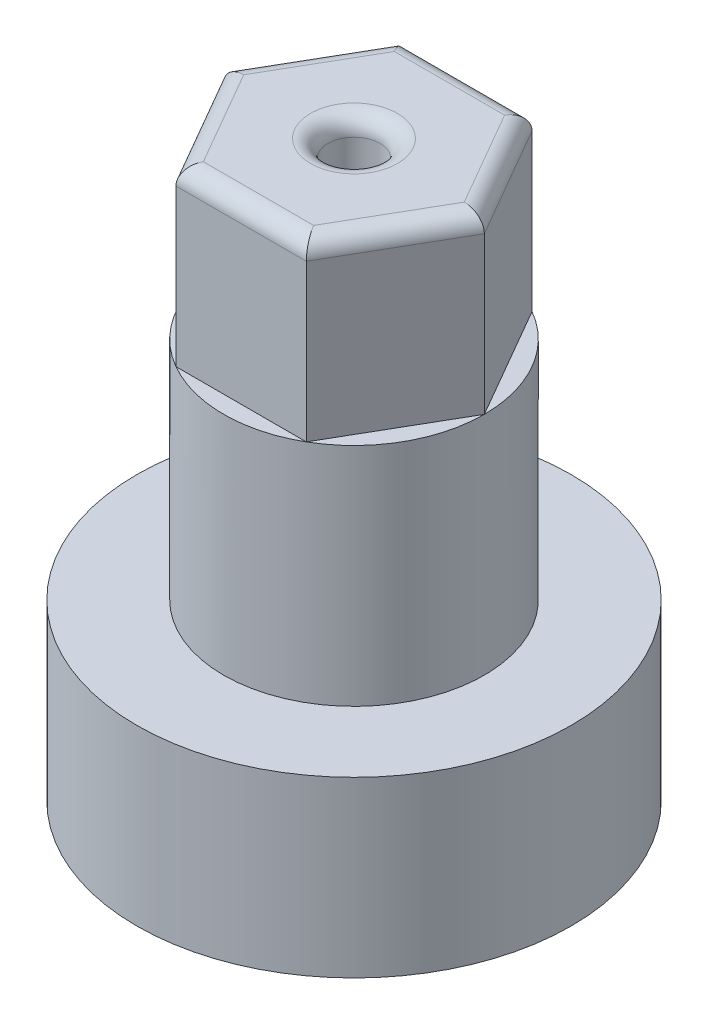
ISO-10303-21;
HEADER;
FILE_DESCRIPTION(('STEP AP214'),'2;1');
FILE_NAME('part.step','',(''),(''),'','','');
FILE_SCHEMA(('AUTOMOTIVE_DESIGN { 1 0 10303 214 1 1 1 1 }'));
ENDSEC;
DATA;
#1=APPLICATION_CONTEXT('core data for automotive mechanical design processes');
#2=APPLICATION_PROTOCOL_DEFINITION('international standard','automotive_design',2000,#1);
#3=PRODUCT_CONTEXT('',#1,'mechanical');
#4=PRODUCT('Part','Part','',(#3));
#5=PRODUCT_RELATED_PRODUCT_CATEGORY('part','',(#4));
#6=PRODUCT_DEFINITION_FORMATION('','',#4);
#7=PRODUCT_DEFINITION_CONTEXT('part definition',#1,'design');
#8=PRODUCT_DEFINITION('design','',#6,#7);
#9=PRODUCT_DEFINITION_SHAPE('','',#8);
#10=(LENGTH_UNIT() NAMED_UNIT(*) SI_UNIT(.MILLI.,.METRE.));
#11=(NAMED_UNIT(*) PLANE_ANGLE_UNIT() SI_UNIT($,.RADIAN.));
#12=(NAMED_UNIT(*) SI_UNIT($,.STERADIAN.) SOLID_ANGLE_UNIT());
#13=UNCERTAINTY_MEASURE_WITH_UNIT(LENGTH_MEASURE(1.E-05),#10,'distance_accuracy_value','');
#14=(GEOMETRIC_REPRESENTATION_CONTEXT(3) GLOBAL_UNCERTAINTY_ASSIGNED_CONTEXT((#13)) GLOBAL_UNIT_ASSIGNED_CONTEXT((#10,
#11,#12)) REPRESENTATION_CONTEXT('',''));
#15=CARTESIAN_POINT('',(0.,0.,0.));
#16=DIRECTION('',(0.,0.,1.));
#17=DIRECTION('',(1.,0.,0.));
#18=AXIS2_PLACEMENT_3D('',#15,#16,#17);
#19=CARTESIAN_POINT('',(0.,23.,0.));
#20=DIRECTION('',(0.,1.,0.));
#21=DIRECTION('',(0.,0.,1.));
#22=AXIS2_PLACEMENT_3D('',#19,#20,#21);
#23=PLANE('',#22);
#24=DIRECTION('',(0.499999999999995,0.,-0.866025403784441));
#25=VECTOR('',#24,1.);
#26=CARTESIAN_POINT('',(3.75000000000008,23.,6.49519052838325));
#27=LINE('',#26,#25);
#28=CARTESIAN_POINT('',(3.75000000000008,23.,6.49519052838325));
#29=VERTEX_POINT('',#28);
#30=CARTESIAN_POINT('',(7.5,23.,0.));
#31=VERTEX_POINT('',#30);
#32=EDGE_CURVE('E140',#29,#31,#27,.T.);
#33=ORIENTED_EDGE('',*,*,#32,.F.);
#34=CARTESIAN_POINT('',(0.,23.,0.));
#35=DIRECTION('',(0.,1.,0.));
#36=DIRECTION('',(0.,0.,1.));
#37=AXIS2_PLACEMENT_3D('',#34,#35,#36);
#38=CIRCLE('',#37,7.5);
#39=EDGE_CURVE('E125',#29,#31,#38,.T.);
#40=ORIENTED_EDGE('',*,*,#39,.T.);
#41=EDGE_LOOP('',(#33,#40));
#42=FACE_BOUND('',#41,.T.);
#43=ADVANCED_FACE('F33',(#42),#23,.T.);
#44=DIRECTION('',(1.,0.,0.));
#45=VECTOR('',#44,1.);
#46=CARTESIAN_POINT('',(-3.74999999999994,23.,6.49519052838332));
#47=LINE('',#46,#45);
#48=CARTESIAN_POINT('',(-3.74999999999994,23.,6.49519052838332));
#49=VERTEX_POINT('',#48);
#50=EDGE_CURVE('E152',#49,#29,#47,.T.);
#51=ORIENTED_EDGE('',*,*,#50,.F.);
#52=EDGE_CURVE('E172',#49,#29,#38,.T.);
#53=ORIENTED_EDGE('',*,*,#52,.T.);
#54=EDGE_LOOP('',(#51,#53));
#55=FACE_BOUND('',#54,.T.);
#56=ADVANCED_FACE('F263',(#55),#23,.T.);
#57=DIRECTION('',(0.500000000000007,0.,0.866025403784435));
#58=VECTOR('',#57,1.);
#59=CARTESIAN_POINT('',(-7.5,23.,0.));
#60=LINE('',#59,#58);
#61=CARTESIAN_POINT('',(-7.5,23.,0.));
#62=VERTEX_POINT('',#61);
#63=EDGE_CURVE('E149',#62,#49,#60,.T.);
#64=ORIENTED_EDGE('',*,*,#63,.F.);
#65=EDGE_CURVE('E333',#62,#49,#38,.T.);
#66=ORIENTED_EDGE('',*,*,#65,.T.);
#67=EDGE_LOOP('',(#64,#66));
#68=FACE_BOUND('',#67,.T.);
#69=ADVANCED_FACE('F269',(#68),#23,.T.);
#70=DIRECTION('',(-0.499999999999995,0.,0.866025403784442));
#71=VECTOR('',#70,1.);
#72=CARTESIAN_POINT('',(-3.75000000000003,23.,-6.49519052838327));
#73=LINE('',#72,#71);
#74=CARTESIAN_POINT('',(-3.75000000000003,23.,-6.49519052838327));
#75=VERTEX_POINT('',#74);
#76=EDGE_CURVE('E137',#75,#62,#73,.T.);
#77=ORIENTED_EDGE('',*,*,#76,.F.);
#78=EDGE_CURVE('E134',#75,#62,#38,.T.);
#79=ORIENTED_EDGE('',*,*,#78,.T.);
#80=EDGE_LOOP('',(#77,#79));
#81=FACE_BOUND('',#80,.T.);
#82=ADVANCED_FACE('F286',(#81),#23,.T.);
#83=DIRECTION('',(-1.,0.,0.));
#84=VECTOR('',#83,1.);
#85=CARTESIAN_POINT('',(3.74999999999998,23.,-6.4951905283833));
#86=LINE('',#85,#84);
#87=CARTESIAN_POINT('',(3.74999999999998,23.,-6.4951905283833));
#88=VERTEX_POINT('',#87);
#89=EDGE_CURVE('E109',#88,#75,#86,.T.);
#90=ORIENTED_EDGE('',*,*,#89,.F.);
#91=EDGE_CURVE('E126',#88,#75,#38,.T.);
#92=ORIENTED_EDGE('',*,*,#91,.T.);
#93=EDGE_LOOP('',(#90,#92));
#94=FACE_BOUND('',#93,.T.);
#95=ADVANCED_FACE('F136',(#94),#23,.T.);
#96=CARTESIAN_POINT('',(7.,10.,0.));
#97=DIRECTION('',(0.,-1.,0.));
#98=DIRECTION('',(0.,0.,-1.));
#99=AXIS2_PLACEMENT_3D('',#96,#97,#98);
#100=CYLINDRICAL_SURFACE('',#99,0.750000000000001);
#101=CARTESIAN_POINT('',(7.,0.,0.));
#102=DIRECTION('',(0.,1.,0.));
#103=DIRECTION('',(0.,0.,1.));
#104=AXIS2_PLACEMENT_3D('',#101,#102,#103);
#105=CIRCLE('',#104,0.750000000000001);
#106=CARTESIAN_POINT('',(7.,0.,0.750000000000001));
#107=VERTEX_POINT('',#106);
#108=EDGE_CURVE('E188',#107,#107,#105,.T.);
#109=ORIENTED_EDGE('',*,*,#108,.F.);
#110=EDGE_LOOP('',(#109));
#111=FACE_BOUND('',#110,.T.);
#112=CARTESIAN_POINT('',(7.,9.,0.));
#113=DIRECTION('',(0.,1.,0.));
#114=DIRECTION('',(0.,0.,1.));
#115=AXIS2_PLACEMENT_3D('',#112,#113,#114);
#116=CIRCLE('',#115,0.750000000000001);
#117=CARTESIAN_POINT('',(7.,9.,0.750000000000001));
#118=VERTEX_POINT('',#117);
#119=EDGE_CURVE('E170',#118,#118,#116,.T.);
#120=ORIENTED_EDGE('',*,*,#119,.T.);
#121=EDGE_LOOP('',(#120));
#122=FACE_BOUND('',#121,.T.);
#123=ADVANCED_FACE('F285',(#111,#122),#100,.F.);
#124=CARTESIAN_POINT('',(0.,10.,7.));
#125=DIRECTION('',(0.,-1.,0.));
#126=DIRECTION('',(0.,0.,-1.));
#127=AXIS2_PLACEMENT_3D('',#124,#125,#126);
#128=CYLINDRICAL_SURFACE('',#127,0.750000000000001);
#129=CARTESIAN_POINT('',(0.,0.,7.));
#130=DIRECTION('',(0.,1.,0.));
#131=DIRECTION('',(0.,0.,1.));
#132=AXIS2_PLACEMENT_3D('',#129,#130,#131);
#133=CIRCLE('',#132,0.750000000000001);
#134=CARTESIAN_POINT('',(0.,0.,7.75));
#135=VERTEX_POINT('',#134);
#136=EDGE_CURVE('E185',#135,#135,#133,.T.);
#137=ORIENTED_EDGE('',*,*,#136,.F.);
#138=EDGE_LOOP('',(#137));
#139=FACE_BOUND('',#138,.T.);
#140=CARTESIAN_POINT('',(0.,9.,7.));
#141=DIRECTION('',(0.,1.,0.));
#142=DIRECTION('',(0.,0.,1.));
#143=AXIS2_PLACEMENT_3D('',#140,#141,#142);
#144=CIRCLE('',#143,0.750000000000001);
#145=CARTESIAN_POINT('',(0.,9.,7.75));
#146=VERTEX_POINT('',#145);
#147=EDGE_CURVE('E167',#146,#146,#144,.T.);
#148=ORIENTED_EDGE('',*,*,#147,.T.);
#149=EDGE_LOOP('',(#148));
#150=FACE_BOUND('',#149,.T.);
#151=ADVANCED_FACE('F291',(#139,#150),#128,.F.);
#152=CARTESIAN_POINT('',(-7.,10.,0.));
#153=DIRECTION('',(0.,-1.,0.));
#154=DIRECTION('',(0.,0.,-1.));
#155=AXIS2_PLACEMENT_3D('',#152,#153,#154);
#156=CYLINDRICAL_SURFACE('',#155,0.750000000000001);
#157=CARTESIAN_POINT('',(-7.,0.,0.));
#158=DIRECTION('',(0.,1.,0.));
#159=DIRECTION('',(0.,0.,1.));
#160=AXIS2_PLACEMENT_3D('',#157,#158,#159);
#161=CIRCLE('',#160,0.750000000000001);
#162=CARTESIAN_POINT('',(-7.,0.,0.749999999999952));
#163=VERTEX_POINT('',#162);
#164=EDGE_CURVE('E182',#163,#163,#161,.T.);
#165=ORIENTED_EDGE('',*,*,#164,.F.);
#166=EDGE_LOOP('',(#165));
#167=FACE_BOUND('',#166,.T.);
#168=CARTESIAN_POINT('',(-7.,9.,0.));
#169=DIRECTION('',(0.,1.,0.));
#170=DIRECTION('',(0.,0.,1.));
#171=AXIS2_PLACEMENT_3D('',#168,#169,#170);
#172=CIRCLE('',#171,0.750000000000001);
#173=CARTESIAN_POINT('',(-7.,9.,0.749999999999952));
#174=VERTEX_POINT('',#173);
#175=EDGE_CURVE('E164',#174,#174,#172,.T.);
#176=ORIENTED_EDGE('',*,*,#175,.T.);
#177=EDGE_LOOP('',(#176));
#178=FACE_BOUND('',#177,.T.);
#179=ADVANCED_FACE('F364',(#167,#178),#156,.F.);
#180=CARTESIAN_POINT('',(0.,10.,-7.));
#181=DIRECTION('',(0.,-1.,0.));
#182=DIRECTION('',(0.,0.,-1.));
#183=AXIS2_PLACEMENT_3D('',#180,#181,#182);
#184=CYLINDRICAL_SURFACE('',#183,0.750000000000002);
#185=CARTESIAN_POINT('',(0.,0.,-7.));
#186=DIRECTION('',(0.,1.,0.));
#187=DIRECTION('',(0.,0.,1.));
#188=AXIS2_PLACEMENT_3D('',#185,#186,#187);
#189=CIRCLE('',#188,0.750000000000002);
#190=CARTESIAN_POINT('',(0.,0.,-6.25));
#191=VERTEX_POINT('',#190);
#192=EDGE_CURVE('E174',#191,#191,#189,.T.);
#193=ORIENTED_EDGE('',*,*,#192,.F.);
#194=EDGE_LOOP('',(#193));
#195=FACE_BOUND('',#194,.T.);
#196=CARTESIAN_POINT('',(0.,9.,-7.));
#197=DIRECTION('',(0.,1.,0.));
#198=DIRECTION('',(0.,0.,1.));
#199=AXIS2_PLACEMENT_3D('',#196,#197,#198);
#200=CIRCLE('',#199,0.750000000000002);
#201=CARTESIAN_POINT('',(0.,9.,-6.25));
#202=VERTEX_POINT('',#201);
#203=EDGE_CURVE('E163',#202,#202,#200,.T.);
#204=ORIENTED_EDGE('',*,*,#203,.T.);
#205=EDGE_LOOP('',(#204));
#206=FACE_BOUND('',#205,.T.);
#207=ADVANCED_FACE('F370',(#195,#206),#184,.F.);
#208=CARTESIAN_POINT('',(0.,10.,0.));
#209=DIRECTION('',(0.,1.,0.));
#210=DIRECTION('',(0.,0.,1.));
#211=AXIS2_PLACEMENT_3D('',#208,#209,#210);
#212=PLANE('',#211);
#213=CARTESIAN_POINT('',(0.,10.,0.));
#214=DIRECTION('',(0.,1.,0.));
#215=DIRECTION('',(0.,0.,1.));
#216=AXIS2_PLACEMENT_3D('',#213,#214,#215);
#217=CIRCLE('',#216,7.5);
#218=CARTESIAN_POINT('',(0.,10.,7.5));
#219=VERTEX_POINT('',#218);
#220=EDGE_CURVE('E175',#219,#219,#217,.T.);
#221=ORIENTED_EDGE('',*,*,#220,.F.);
#222=EDGE_LOOP('',(#221));
#223=FACE_BOUND('',#222,.T.);
#224=CARTESIAN_POINT('',(0.,10.,0.));
#225=DIRECTION('',(0.,1.,0.));
#226=DIRECTION('',(0.,0.,1.));
#227=AXIS2_PLACEMENT_3D('',#224,#225,#226);
#228=CIRCLE('',#227,12.5);
#229=CARTESIAN_POINT('',(0.,10.,12.5));
#230=VERTEX_POINT('',#229);
#231=EDGE_CURVE('E179',#230,#230,#228,.T.);
#232=ORIENTED_EDGE('',*,*,#231,.T.);
#233=EDGE_LOOP('',(#232));
#234=FACE_BOUND('',#233,.T.);
#235=ADVANCED_FACE('F376',(#223,#234),#212,.T.);
#236=CARTESIAN_POINT('',(0.,0.,0.));
#237=DIRECTION('',(0.,1.,0.));
#238=DIRECTION('',(0.,0.,1.));
#239=AXIS2_PLACEMENT_3D('',#236,#237,#238);
#240=PLANE('',#239);
#241=CARTESIAN_POINT('',(0.,0.,0.));
#242=DIRECTION('',(0.,1.,0.));
#243=DIRECTION('',(0.,0.,1.));
#244=AXIS2_PLACEMENT_3D('',#241,#242,#243);
#245=CIRCLE('',#244,1.5);
#246=CARTESIAN_POINT('',(0.,0.,1.5));
#247=VERTEX_POINT('',#246);
#248=EDGE_CURVE('E143',#247,#247,#245,.T.);
#249=ORIENTED_EDGE('',*,*,#248,.T.);
#250=EDGE_LOOP('',(#249));
#251=FACE_BOUND('',#250,.T.);
#252=CARTESIAN_POINT('',(0.,0.,0.));
#253=DIRECTION('',(0.,1.,0.));
#254=DIRECTION('',(0.,0.,1.));
#255=AXIS2_PLACEMENT_3D('',#252,#253,#254);
#256=CIRCLE('',#255,12.5);
#257=CARTESIAN_POINT('',(0.,0.,12.5));
#258=VERTEX_POINT('',#257);
#259=EDGE_CURVE('E191',#258,#258,#256,.T.);
#260=ORIENTED_EDGE('',*,*,#259,.F.);
#261=EDGE_LOOP('',(#260));
#262=FACE_BOUND('',#261,.T.);
#263=ORIENTED_EDGE('',*,*,#108,.T.);
#264=EDGE_LOOP('',(#263));
#265=FACE_BOUND('',#264,.T.);
#266=ORIENTED_EDGE('',*,*,#136,.T.);
#267=EDGE_LOOP('',(#266));
#268=FACE_BOUND('',#267,.T.);
#269=ORIENTED_EDGE('',*,*,#164,.T.);
#270=EDGE_LOOP('',(#269));
#271=FACE_BOUND('',#270,.T.);
#272=ORIENTED_EDGE('',*,*,#192,.T.);
#273=EDGE_LOOP('',(#272));
#274=FACE_BOUND('',#273,.T.);
#275=ADVANCED_FACE('F244',(#251,#262,#265,#268,#271,#274),#240,.F.);
#276=CARTESIAN_POINT('',(0.,10.,0.));
#277=DIRECTION('',(0.,-1.,0.));
#278=DIRECTION('',(0.,0.,-1.));
#279=AXIS2_PLACEMENT_3D('',#276,#277,#278);
#280=CYLINDRICAL_SURFACE('',#279,12.5);
#281=ORIENTED_EDGE('',*,*,#231,.F.);
#282=EDGE_LOOP('',(#281));
#283=FACE_BOUND('',#282,.T.);
#284=ORIENTED_EDGE('',*,*,#259,.T.);
#285=EDGE_LOOP('',(#284));
#286=FACE_BOUND('',#285,.T.);
#287=ADVANCED_FACE('F283',(#283,#286),#280,.T.);
#288=CARTESIAN_POINT('',(0.,23.,0.));
#289=DIRECTION('',(0.,-1.,0.));
#290=DIRECTION('',(0.,0.,-1.));
#291=AXIS2_PLACEMENT_3D('',#288,#289,#290);
#292=CYLINDRICAL_SURFACE('',#291,7.5);
#293=ORIENTED_EDGE('',*,*,#39,.F.);
#294=ORIENTED_EDGE('',*,*,#52,.F.);
#295=ORIENTED_EDGE('',*,*,#65,.F.);
#296=ORIENTED_EDGE('',*,*,#78,.F.);
#297=ORIENTED_EDGE('',*,*,#91,.F.);
#298=EDGE_CURVE('E118',#31,#88,#38,.T.);
#299=ORIENTED_EDGE('',*,*,#298,.F.);
#300=EDGE_LOOP('',(#293,#294,#295,#296,#297,#299));
#301=FACE_BOUND('',#300,.T.);
#302=ORIENTED_EDGE('',*,*,#220,.T.);
#303=EDGE_LOOP('',(#302));
#304=FACE_BOUND('',#303,.T.);
#305=ADVANCED_FACE('F130',(#301,#304),#292,.T.);
#306=DIRECTION('',(-0.500000000000001,0.,-0.866025403784438));
#307=VECTOR('',#306,1.);
#308=CARTESIAN_POINT('',(7.5,23.,0.));
#309=LINE('',#308,#307);
#310=EDGE_CURVE('E121',#31,#88,#309,.T.);
#311=ORIENTED_EDGE('',*,*,#310,.F.);
#312=ORIENTED_EDGE('',*,*,#298,.T.);
#313=EDGE_LOOP('',(#311,#312));
#314=FACE_BOUND('',#313,.T.);
#315=ADVANCED_FACE('F120',(#314),#23,.T.);
#316=CARTESIAN_POINT('',(0.,9.,0.));
#317=DIRECTION('',(0.,1.,0.));
#318=DIRECTION('',(0.,0.,1.));
#319=AXIS2_PLACEMENT_3D('',#316,#317,#318);
#320=PLANE('',#319);
#321=ORIENTED_EDGE('',*,*,#203,.F.);
#322=EDGE_LOOP('',(#321));
#323=FACE_BOUND('',#322,.T.);
#324=ADVANCED_FACE('F275',(#323),#320,.F.);
#325=ORIENTED_EDGE('',*,*,#175,.F.);
#326=EDGE_LOOP('',(#325));
#327=FACE_BOUND('',#326,.T.);
#328=ADVANCED_FACE('F280',(#327),#320,.F.);
#329=ORIENTED_EDGE('',*,*,#147,.F.);
#330=EDGE_LOOP('',(#329));
#331=FACE_BOUND('',#330,.T.);
#332=ADVANCED_FACE('F349',(#331),#320,.F.);
#333=ORIENTED_EDGE('',*,*,#119,.F.);
#334=EDGE_LOOP('',(#333));
#335=FACE_BOUND('',#334,.T.);
#336=ADVANCED_FACE('F282',(#335),#320,.F.);
#337=CARTESIAN_POINT('',(3.75000000000008,33.,6.49519052838325));
#338=DIRECTION('',(-0.866025403784442,0.,-0.499999999999995));
#339=DIRECTION('',(-0.499999999999995,0.,0.866025403784442));
#340=AXIS2_PLACEMENT_3D('',#337,#338,#339);
#341=PLANE('',#340);
#342=DIRECTION('',(0.,-1.,0.));
#343=VECTOR('',#342,1.);
#344=CARTESIAN_POINT('',(7.5,33.,0.));
#345=LINE('',#344,#343);
#346=CARTESIAN_POINT('',(7.5,32.,0.));
#347=VERTEX_POINT('',#346);
#348=EDGE_CURVE('E112',#347,#31,#345,.T.);
#349=ORIENTED_EDGE('',*,*,#348,.F.);
#350=DIRECTION('',(0.499999999999995,0.,-0.866025403784442));
#351=VECTOR('',#350,1.);
#352=CARTESIAN_POINT('',(3.75000000000008,32.,6.49519052838325));
#353=LINE('',#352,#351);
#354=CARTESIAN_POINT('',(3.75000000000008,32.,6.49519052838325));
#355=VERTEX_POINT('',#354);
#356=EDGE_CURVE('E42',#347,#355,#353,.F.);
#357=ORIENTED_EDGE('',*,*,#356,.T.);
#358=DIRECTION('',(0.,-1.,0.));
#359=VECTOR('',#358,1.);
#360=CARTESIAN_POINT('',(3.75000000000008,33.,6.49519052838325));
#361=LINE('',#360,#359);
#362=EDGE_CURVE('E155',#355,#29,#361,.T.);
#363=ORIENTED_EDGE('',*,*,#362,.T.);
#364=ORIENTED_EDGE('',*,*,#32,.T.);
#365=EDGE_LOOP('',(#349,#357,#363,#364));
#366=FACE_BOUND('',#365,.T.);
#367=ADVANCED_FACE('F313',(#366),#341,.F.);
#368=CARTESIAN_POINT('',(7.5,33.,0.));
#369=DIRECTION('',(-0.866025403784438,0.,0.500000000000001));
#370=DIRECTION('',(0.500000000000001,0.,0.866025403784438));
#371=AXIS2_PLACEMENT_3D('',#368,#369,#370);
#372=PLANE('',#371);
#373=DIRECTION('',(0.,-1.,0.));
#374=VECTOR('',#373,1.);
#375=CARTESIAN_POINT('',(3.74999999999998,33.,-6.4951905283833));
#376=LINE('',#375,#374);
#377=CARTESIAN_POINT('',(3.74999999999998,32.,-6.4951905283833));
#378=VERTEX_POINT('',#377);
#379=EDGE_CURVE('E105',#378,#88,#376,.T.);
#380=ORIENTED_EDGE('',*,*,#379,.F.);
#381=DIRECTION('',(-0.500000000000001,0.,-0.866025403784438));
#382=VECTOR('',#381,1.);
#383=CARTESIAN_POINT('',(7.5,32.,0.));
#384=LINE('',#383,#382);
#385=EDGE_CURVE('E50',#378,#347,#384,.F.);
#386=ORIENTED_EDGE('',*,*,#385,.T.);
#387=ORIENTED_EDGE('',*,*,#348,.T.);
#388=ORIENTED_EDGE('',*,*,#310,.T.);
#389=EDGE_LOOP('',(#380,#386,#387,#388));
#390=FACE_BOUND('',#389,.T.);
#391=ADVANCED_FACE('F139',(#390),#372,.F.);
#392=CARTESIAN_POINT('',(3.74999999999998,33.,-6.4951905283833));
#393=DIRECTION('',(0.,0.,1.));
#394=DIRECTION('',(1.,0.,0.));
#395=AXIS2_PLACEMENT_3D('',#392,#393,#394);
#396=PLANE('',#395);
#397=DIRECTION('',(0.,-1.,0.));
#398=VECTOR('',#397,1.);
#399=CARTESIAN_POINT('',(-3.75000000000003,33.,-6.49519052838327));
#400=LINE('',#399,#398);
#401=CARTESIAN_POINT('',(-3.75000000000003,32.,-6.49519052838327));
#402=VERTEX_POINT('',#401);
#403=EDGE_CURVE('E113',#402,#75,#400,.T.);
#404=ORIENTED_EDGE('',*,*,#403,.F.);
#405=DIRECTION('',(-1.,0.,0.));
#406=VECTOR('',#405,1.);
#407=CARTESIAN_POINT('',(3.74999999999998,32.,-6.4951905283833));
#408=LINE('',#407,#406);
#409=EDGE_CURVE('E58',#402,#378,#408,.F.);
#410=ORIENTED_EDGE('',*,*,#409,.T.);
#411=ORIENTED_EDGE('',*,*,#379,.T.);
#412=ORIENTED_EDGE('',*,*,#89,.T.);
#413=EDGE_LOOP('',(#404,#410,#411,#412));
#414=FACE_BOUND('',#413,.T.);
#415=ADVANCED_FACE('F107',(#414),#396,.F.);
#416=CARTESIAN_POINT('',(-3.75000000000003,33.,-6.49519052838327));
#417=DIRECTION('',(0.866025403784442,0.,0.499999999999995));
#418=DIRECTION('',(0.499999999999995,0.,-0.866025403784442));
#419=AXIS2_PLACEMENT_3D('',#416,#417,#418);
#420=PLANE('',#419);
#421=DIRECTION('',(0.,-1.,0.));
#422=VECTOR('',#421,1.);
#423=CARTESIAN_POINT('',(-7.5,33.,0.));
#424=LINE('',#423,#422);
#425=CARTESIAN_POINT('',(-7.5,32.,0.));
#426=VERTEX_POINT('',#425);
#427=EDGE_CURVE('E159',#426,#62,#424,.T.);
#428=ORIENTED_EDGE('',*,*,#427,.F.);
#429=DIRECTION('',(-0.499999999999995,0.,0.866025403784442));
#430=VECTOR('',#429,1.);
#431=CARTESIAN_POINT('',(-3.75000000000003,32.,-6.49519052838327));
#432=LINE('',#431,#430);
#433=EDGE_CURVE('E218',#426,#402,#432,.F.);
#434=ORIENTED_EDGE('',*,*,#433,.T.);
#435=ORIENTED_EDGE('',*,*,#403,.T.);
#436=ORIENTED_EDGE('',*,*,#76,.T.);
#437=EDGE_LOOP('',(#428,#434,#435,#436));
#438=FACE_BOUND('',#437,.T.);
#439=ADVANCED_FACE('F302',(#438),#420,.F.);
#440=CARTESIAN_POINT('',(-7.5,33.,0.));
#441=DIRECTION('',(0.866025403784434,0.,-0.500000000000007));
#442=DIRECTION('',(-0.500000000000007,0.,-0.866025403784435));
#443=AXIS2_PLACEMENT_3D('',#440,#441,#442);
#444=PLANE('',#443);
#445=DIRECTION('',(0.,-1.,0.));
#446=VECTOR('',#445,1.);
#447=CARTESIAN_POINT('',(-3.74999999999994,33.,6.49519052838332));
#448=LINE('',#447,#446);
#449=CARTESIAN_POINT('',(-3.74999999999994,32.,6.49519052838332));
#450=VERTEX_POINT('',#449);
#451=EDGE_CURVE('E157',#450,#49,#448,.T.);
#452=ORIENTED_EDGE('',*,*,#451,.F.);
#453=DIRECTION('',(0.500000000000007,0.,0.866025403784435));
#454=VECTOR('',#453,1.);
#455=CARTESIAN_POINT('',(-7.5,32.,0.));
#456=LINE('',#455,#454);
#457=EDGE_CURVE('E216',#450,#426,#456,.F.);
#458=ORIENTED_EDGE('',*,*,#457,.T.);
#459=ORIENTED_EDGE('',*,*,#427,.T.);
#460=ORIENTED_EDGE('',*,*,#63,.T.);
#461=EDGE_LOOP('',(#452,#458,#459,#460));
#462=FACE_BOUND('',#461,.T.);
#463=ADVANCED_FACE('F328',(#462),#444,.F.);
#464=CARTESIAN_POINT('',(-3.74999999999994,33.,6.49519052838332));
#465=DIRECTION('',(0.,0.,-1.));
#466=DIRECTION('',(-1.,0.,0.));
#467=AXIS2_PLACEMENT_3D('',#464,#465,#466);
#468=PLANE('',#467);
#469=ORIENTED_EDGE('',*,*,#362,.F.);
#470=DIRECTION('',(1.,0.,0.));
#471=VECTOR('',#470,1.);
#472=CARTESIAN_POINT('',(-3.74999999999994,32.,6.49519052838332));
#473=LINE('',#472,#471);
#474=EDGE_CURVE('E213',#355,#450,#473,.F.);
#475=ORIENTED_EDGE('',*,*,#474,.T.);
#476=ORIENTED_EDGE('',*,*,#451,.T.);
#477=ORIENTED_EDGE('',*,*,#50,.T.);
#478=EDGE_LOOP('',(#469,#475,#476,#477));
#479=FACE_BOUND('',#478,.T.);
#480=ADVANCED_FACE('F259',(#479),#468,.F.);
#481=CARTESIAN_POINT('',(0.,33.,0.));
#482=DIRECTION('',(0.,1.,0.));
#483=DIRECTION('',(0.,0.,1.));
#484=AXIS2_PLACEMENT_3D('',#481,#482,#483);
#485=PLANE('',#484);
#486=DIRECTION('',(0.500000000000007,0.,0.866025403784435));
#487=VECTOR('',#486,1.);
#488=CARTESIAN_POINT('',(-2.8839745962155,33.,5.99519052838332));
#489=LINE('',#488,#487);
#490=CARTESIAN_POINT('',(-6.34529946162075,33.,0.));
#491=VERTEX_POINT('',#490);
#492=CARTESIAN_POINT('',(-3.17264973081032,33.,5.49519052838332));
#493=VERTEX_POINT('',#492);
#494=EDGE_CURVE('E208',#491,#493,#489,.T.);
#495=ORIENTED_EDGE('',*,*,#494,.T.);
#496=DIRECTION('',(1.,0.,0.));
#497=VECTOR('',#496,1.);
#498=CARTESIAN_POINT('',(3.75000000000007,33.,5.49519052838325));
#499=LINE('',#498,#497);
#500=CARTESIAN_POINT('',(3.17264973081044,33.,5.49519052838325));
#501=VERTEX_POINT('',#500);
#502=EDGE_CURVE('E210',#493,#501,#499,.T.);
#503=ORIENTED_EDGE('',*,*,#502,.T.);
#504=DIRECTION('',(0.499999999999995,0.,-0.866025403784442));
#505=VECTOR('',#504,1.);
#506=CARTESIAN_POINT('',(6.63397459621556,33.,-0.499999999999995));
#507=LINE('',#506,#505);
#508=CARTESIAN_POINT('',(6.34529946162075,33.,0.));
#509=VERTEX_POINT('',#508);
#510=EDGE_CURVE('E200',#501,#509,#507,.T.);
#511=ORIENTED_EDGE('',*,*,#510,.T.);
#512=DIRECTION('',(-0.500000000000001,0.,-0.866025403784438));
#513=VECTOR('',#512,1.);
#514=CARTESIAN_POINT('',(2.88397459621555,33.,-5.9951905283833));
#515=LINE('',#514,#513);
#516=CARTESIAN_POINT('',(3.17264973081036,33.,-5.4951905283833));
#517=VERTEX_POINT('',#516);
#518=EDGE_CURVE('E202',#509,#517,#515,.T.);
#519=ORIENTED_EDGE('',*,*,#518,.T.);
#520=DIRECTION('',(-1.,0.,0.));
#521=VECTOR('',#520,1.);
#522=CARTESIAN_POINT('',(-3.75000000000003,33.,-5.49519052838327));
#523=LINE('',#522,#521);
#524=CARTESIAN_POINT('',(-3.1726497308104,33.,-5.49519052838327));
#525=VERTEX_POINT('',#524);
#526=EDGE_CURVE('E204',#517,#525,#523,.T.);
#527=ORIENTED_EDGE('',*,*,#526,.T.);
#528=DIRECTION('',(-0.499999999999995,0.,0.866025403784442));
#529=VECTOR('',#528,1.);
#530=CARTESIAN_POINT('',(-6.63397459621556,33.,0.500000000000048));
#531=LINE('',#530,#529);
#532=EDGE_CURVE('E206',#525,#491,#531,.T.);
#533=ORIENTED_EDGE('',*,*,#532,.T.);
#534=EDGE_LOOP('',(#495,#503,#511,#519,#527,#533));
#535=FACE_BOUND('',#534,.T.);
#536=CARTESIAN_POINT('',(0.,33.,0.));
#537=DIRECTION('',(0.,1.,0.));
#538=DIRECTION('',(0.,0.,1.));
#539=AXIS2_PLACEMENT_3D('',#536,#537,#538);
#540=CIRCLE('',#539,2.5);
#541=CARTESIAN_POINT('',(0.,33.,2.5));
#542=VERTEX_POINT('',#541);
#543=EDGE_CURVE('E178',#542,#542,#540,.F.);
#544=ORIENTED_EDGE('',*,*,#543,.T.);
#545=EDGE_LOOP('',(#544));
#546=FACE_BOUND('',#545,.T.);
#547=ADVANCED_FACE('F250',(#535,#546),#485,.T.);
#548=CARTESIAN_POINT('',(0.,0.,0.));
#549=DIRECTION('',(0.,1.,0.));
#550=DIRECTION('',(0.,0.,1.));
#551=AXIS2_PLACEMENT_3D('',#548,#549,#550);
#552=CYLINDRICAL_SURFACE('',#551,1.5);
#553=CARTESIAN_POINT('',(0.,32.,0.));
#554=DIRECTION('',(0.,1.,0.));
#555=DIRECTION('',(0.,0.,1.));
#556=AXIS2_PLACEMENT_3D('',#553,#554,#555);
#557=CIRCLE('',#556,1.5);
#558=CARTESIAN_POINT('',(0.,32.,1.5));
#559=VERTEX_POINT('',#558);
#560=EDGE_CURVE('E11',#559,#559,#557,.T.);
#561=ORIENTED_EDGE('',*,*,#560,.T.);
#562=EDGE_LOOP('',(#561));
#563=FACE_BOUND('',#562,.T.);
#564=ORIENTED_EDGE('',*,*,#248,.F.);
#565=EDGE_LOOP('',(#564));
#566=FACE_BOUND('',#565,.T.);
#567=ADVANCED_FACE('F247',(#563,#566),#552,.F.);
#568=CARTESIAN_POINT('',(0.,32.,-5.49519052838329));
#569=DIRECTION('',(1.,0.,0.));
#570=DIRECTION('',(0.,0.,-1.));
#571=AXIS2_PLACEMENT_3D('',#568,#569,#570);
#572=CYLINDRICAL_SURFACE('',#571,1.);
#573=CARTESIAN_POINT('',(3.17264973081036,32.,-5.4951905283833));
#574=DIRECTION('',(0.86602540378444,0.,0.499999999999998));
#575=DIRECTION('',(-0.499999999999998,0.,0.86602540378444));
#576=AXIS2_PLACEMENT_3D('',#573,#574,#575);
#577=ELLIPSE('',#576,1.15470053837925,1.);
#578=EDGE_CURVE('E232',#378,#517,#577,.T.);
#579=ORIENTED_EDGE('',*,*,#578,.F.);
#580=ORIENTED_EDGE('',*,*,#409,.F.);
#581=CARTESIAN_POINT('',(-3.1726497308104,32.,-5.49519052838327));
#582=DIRECTION('',(0.866025403784436,0.,-0.500000000000004));
#583=DIRECTION('',(0.500000000000004,0.,0.866025403784436));
#584=AXIS2_PLACEMENT_3D('',#581,#582,#583);
#585=ELLIPSE('',#584,1.15470053837925,1.);
#586=EDGE_CURVE('E37',#525,#402,#585,.F.);
#587=ORIENTED_EDGE('',*,*,#586,.F.);
#588=ORIENTED_EDGE('',*,*,#526,.F.);
#589=EDGE_LOOP('',(#579,#580,#587,#588));
#590=FACE_BOUND('',#589,.T.);
#591=ADVANCED_FACE('F249',(#590),#572,.T.);
#592=CARTESIAN_POINT('',(-4.75897459621557,32.,-2.74759526419161));
#593=DIRECTION('',(0.499999999999995,0.,-0.866025403784442));
#594=DIRECTION('',(-0.866025403784442,0.,-0.499999999999995));
#595=AXIS2_PLACEMENT_3D('',#592,#593,#594);
#596=CYLINDRICAL_SURFACE('',#595,1.);
#597=ORIENTED_EDGE('',*,*,#586,.T.);
#598=ORIENTED_EDGE('',*,*,#433,.F.);
#599=CARTESIAN_POINT('',(-6.34529946162075,32.,0.));
#600=DIRECTION('',(0.,0.,-1.));
#601=DIRECTION('',(1.,0.,0.));
#602=AXIS2_PLACEMENT_3D('',#599,#600,#601);
#603=ELLIPSE('',#602,1.15470053837925,1.);
#604=EDGE_CURVE('E230',#491,#426,#603,.F.);
#605=ORIENTED_EDGE('',*,*,#604,.F.);
#606=ORIENTED_EDGE('',*,*,#532,.F.);
#607=EDGE_LOOP('',(#597,#598,#605,#606));
#608=FACE_BOUND('',#607,.T.);
#609=ADVANCED_FACE('F257',(#608),#596,.T.);
#610=CARTESIAN_POINT('',(4.75897459621555,32.,-2.74759526419165));
#611=DIRECTION('',(0.500000000000001,0.,0.866025403784438));
#612=DIRECTION('',(0.866025403784438,0.,-0.500000000000001));
#613=AXIS2_PLACEMENT_3D('',#610,#611,#612);
#614=CYLINDRICAL_SURFACE('',#613,1.);
#615=ORIENTED_EDGE('',*,*,#578,.T.);
#616=ORIENTED_EDGE('',*,*,#518,.F.);
#617=CARTESIAN_POINT('',(6.34529946162075,32.,0.));
#618=DIRECTION('',(0.,0.,1.));
#619=DIRECTION('',(-1.,0.,0.));
#620=AXIS2_PLACEMENT_3D('',#617,#618,#619);
#621=ELLIPSE('',#620,1.15470053837925,1.);
#622=EDGE_CURVE('E227',#347,#509,#621,.T.);
#623=ORIENTED_EDGE('',*,*,#622,.F.);
#624=ORIENTED_EDGE('',*,*,#385,.F.);
#625=EDGE_LOOP('',(#615,#616,#623,#624));
#626=FACE_BOUND('',#625,.T.);
#627=ADVANCED_FACE('F305',(#626),#614,.T.);
#628=CARTESIAN_POINT('',(-4.75897459621553,32.,2.74759526419168));
#629=DIRECTION('',(-0.500000000000007,0.,-0.866025403784435));
#630=DIRECTION('',(-0.866025403784434,0.,0.500000000000007));
#631=AXIS2_PLACEMENT_3D('',#628,#629,#630);
#632=CYLINDRICAL_SURFACE('',#631,1.);
#633=ORIENTED_EDGE('',*,*,#604,.T.);
#634=ORIENTED_EDGE('',*,*,#457,.F.);
#635=CARTESIAN_POINT('',(-3.17264973081032,32.,5.49519052838332));
#636=DIRECTION('',(-0.866025403784443,0.,-0.499999999999992));
#637=DIRECTION('',(0.499999999999992,0.,-0.866025403784443));
#638=AXIS2_PLACEMENT_3D('',#635,#636,#637);
#639=ELLIPSE('',#638,1.15470053837925,1.);
#640=EDGE_CURVE('E225',#493,#450,#639,.F.);
#641=ORIENTED_EDGE('',*,*,#640,.F.);
#642=ORIENTED_EDGE('',*,*,#494,.F.);
#643=EDGE_LOOP('',(#633,#634,#641,#642));
#644=FACE_BOUND('',#643,.T.);
#645=ADVANCED_FACE('F325',(#644),#632,.T.);
#646=CARTESIAN_POINT('',(4.7589745962156,32.,2.74759526419163));
#647=DIRECTION('',(-0.499999999999995,0.,0.866025403784442));
#648=DIRECTION('',(0.866025403784442,0.,0.499999999999995));
#649=AXIS2_PLACEMENT_3D('',#646,#647,#648);
#650=CYLINDRICAL_SURFACE('',#649,1.);
#651=ORIENTED_EDGE('',*,*,#622,.T.);
#652=ORIENTED_EDGE('',*,*,#510,.F.);
#653=CARTESIAN_POINT('',(3.17264973081044,32.,5.49519052838325));
#654=DIRECTION('',(-0.866025403784434,0.,0.500000000000007));
#655=DIRECTION('',(0.500000000000007,0.,0.866025403784435));
#656=AXIS2_PLACEMENT_3D('',#653,#654,#655);
#657=ELLIPSE('',#656,1.15470053837925,1.);
#658=EDGE_CURVE('E223',#355,#501,#657,.T.);
#659=ORIENTED_EDGE('',*,*,#658,.F.);
#660=ORIENTED_EDGE('',*,*,#356,.F.);
#661=EDGE_LOOP('',(#651,#652,#659,#660));
#662=FACE_BOUND('',#661,.T.);
#663=ADVANCED_FACE('F310',(#662),#650,.T.);
#664=CARTESIAN_POINT('',(0.,32.,5.49519052838329));
#665=DIRECTION('',(-1.,0.,0.));
#666=DIRECTION('',(0.,0.,1.));
#667=AXIS2_PLACEMENT_3D('',#664,#665,#666);
#668=CYLINDRICAL_SURFACE('',#667,1.);
#669=ORIENTED_EDGE('',*,*,#640,.T.);
#670=ORIENTED_EDGE('',*,*,#474,.F.);
#671=ORIENTED_EDGE('',*,*,#658,.T.);
#672=ORIENTED_EDGE('',*,*,#502,.F.);
#673=EDGE_LOOP('',(#669,#670,#671,#672));
#674=FACE_BOUND('',#673,.T.);
#675=ADVANCED_FACE('F319',(#674),#668,.T.);
#676=CARTESIAN_POINT('',(0.,32.,0.));
#677=DIRECTION('',(0.,1.,0.));
#678=DIRECTION('',(0.,0.,1.));
#679=AXIS2_PLACEMENT_3D('',#676,#677,#678);
#680=TOROIDAL_SURFACE('',#679,2.5,1.);
#681=ORIENTED_EDGE('',*,*,#543,.F.);
#682=EDGE_LOOP('',(#681));
#683=FACE_BOUND('',#682,.T.);
#684=ORIENTED_EDGE('',*,*,#560,.F.);
#685=EDGE_LOOP('',(#684));
#686=FACE_BOUND('',#685,.T.);
#687=ADVANCED_FACE('F35',(#683,#686),#680,.T.);
#688=CLOSED_SHELL('',(#43,#56,#69,#82,#95,#123,#151,#179,#207,#235,#275,#287,#305,#315,#324,
#328,#332,#336,#367,#391,#415,#439,#463,#480,#547,#567,#591,#609,#627,#645,#663,#675,#687));
#689=MANIFOLD_SOLID_BREP('B2',#688);
#690=ADVANCED_BREP_SHAPE_REPRESENTATION('',(#18,#689),#14);
#691=SHAPE_DEFINITION_REPRESENTATION(#9,#690);
ENDSEC;
END-ISO-10303-21;
